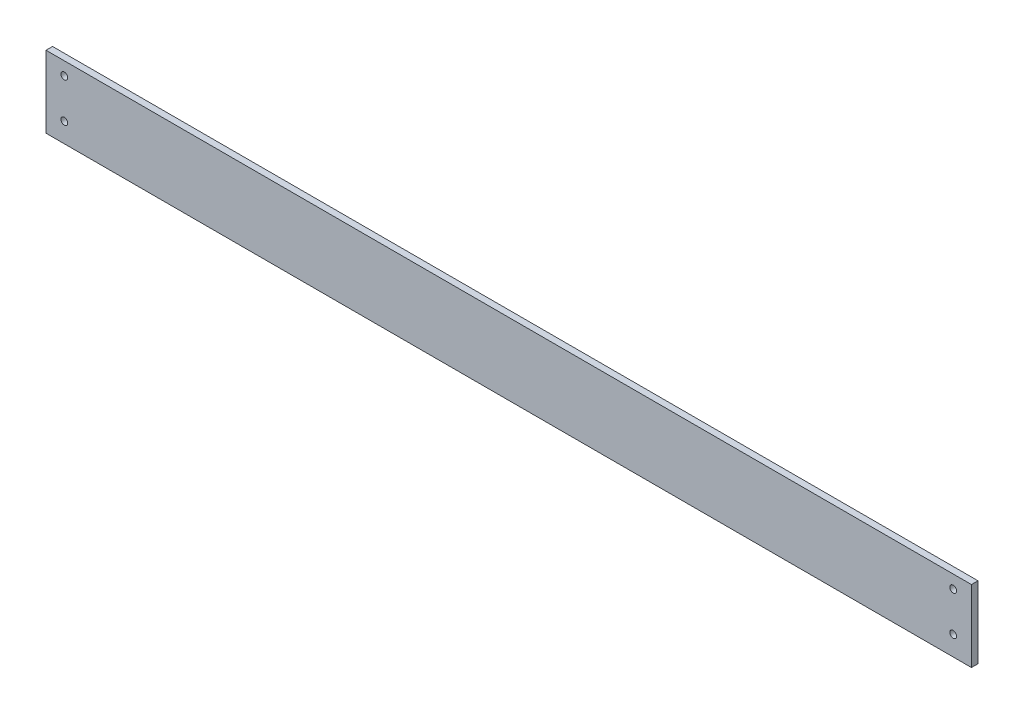
ISO-10303-21;
HEADER;
FILE_DESCRIPTION(('STEP AP214'),'2;1');
FILE_NAME('part.step','',(''),(''),'','','');
FILE_SCHEMA(('AUTOMOTIVE_DESIGN { 1 0 10303 214 1 1 1 1 }'));
ENDSEC;
DATA;
#1=APPLICATION_CONTEXT('core data for automotive mechanical design processes');
#2=APPLICATION_PROTOCOL_DEFINITION('international standard','automotive_design',2000,#1);
#3=PRODUCT_CONTEXT('',#1,'mechanical');
#4=PRODUCT('Part','Part','',(#3));
#5=PRODUCT_RELATED_PRODUCT_CATEGORY('part','',(#4));
#6=PRODUCT_DEFINITION_FORMATION('','',#4);
#7=PRODUCT_DEFINITION_CONTEXT('part definition',#1,'design');
#8=PRODUCT_DEFINITION('design','',#6,#7);
#9=PRODUCT_DEFINITION_SHAPE('','',#8);
#10=(LENGTH_UNIT() NAMED_UNIT(*) SI_UNIT(.MILLI.,.METRE.));
#11=(NAMED_UNIT(*) PLANE_ANGLE_UNIT() SI_UNIT($,.RADIAN.));
#12=(NAMED_UNIT(*) SI_UNIT($,.STERADIAN.) SOLID_ANGLE_UNIT());
#13=UNCERTAINTY_MEASURE_WITH_UNIT(LENGTH_MEASURE(1.E-05),#10,'distance_accuracy_value','');
#14=(GEOMETRIC_REPRESENTATION_CONTEXT(3) GLOBAL_UNCERTAINTY_ASSIGNED_CONTEXT((#13)) GLOBAL_UNIT_ASSIGNED_CONTEXT((#10,
#11,#12)) REPRESENTATION_CONTEXT('',''));
#15=CARTESIAN_POINT('',(0.,0.,0.));
#16=DIRECTION('',(0.,0.,1.));
#17=DIRECTION('',(1.,0.,0.));
#18=AXIS2_PLACEMENT_3D('',#15,#16,#17);
#19=CARTESIAN_POINT('',(0.,55.,0.));
#20=DIRECTION('',(0.,-1.,0.));
#21=DIRECTION('',(0.,0.,-1.));
#22=AXIS2_PLACEMENT_3D('',#19,#20,#21);
#23=PLANE('',#22);
#24=DIRECTION('',(-1.,0.,0.));
#25=VECTOR('',#24,1.);
#26=CARTESIAN_POINT('',(708.,55.,-4.99999999999998));
#27=LINE('',#26,#25);
#28=CARTESIAN_POINT('',(708.,55.,-4.99999999999998));
#29=VERTEX_POINT('',#28);
#30=CARTESIAN_POINT('',(0.,55.,-4.99999999999998));
#31=VERTEX_POINT('',#30);
#32=EDGE_CURVE('E11',#29,#31,#27,.T.);
#33=ORIENTED_EDGE('',*,*,#32,.T.);
#34=DIRECTION('',(0.,0.,1.));
#35=VECTOR('',#34,1.);
#36=CARTESIAN_POINT('',(0.,55.,0.));
#37=LINE('',#36,#35);
#38=CARTESIAN_POINT('',(0.,55.,0.));
#39=VERTEX_POINT('',#38);
#40=EDGE_CURVE('E46',#31,#39,#37,.T.);
#41=ORIENTED_EDGE('',*,*,#40,.T.);
#42=DIRECTION('',(-1.,0.,0.));
#43=VECTOR('',#42,1.);
#44=CARTESIAN_POINT('',(708.,55.,0.));
#45=LINE('',#44,#43);
#46=CARTESIAN_POINT('',(708.,55.,0.));
#47=VERTEX_POINT('',#46);
#48=EDGE_CURVE('E97',#47,#39,#45,.T.);
#49=ORIENTED_EDGE('',*,*,#48,.F.);
#50=DIRECTION('',(0.,0.,1.));
#51=VECTOR('',#50,1.);
#52=CARTESIAN_POINT('',(708.,55.,0.));
#53=LINE('',#52,#51);
#54=EDGE_CURVE('E41',#29,#47,#53,.T.);
#55=ORIENTED_EDGE('',*,*,#54,.F.);
#56=EDGE_LOOP('',(#33,#41,#49,#55));
#57=FACE_BOUND('',#56,.T.);
#58=ADVANCED_FACE('F38',(#57),#23,.F.);
#59=CARTESIAN_POINT('',(708.,55.,-4.99999999999998));
#60=DIRECTION('',(0.,0.,1.));
#61=DIRECTION('',(0.,-1.,0.));
#62=AXIS2_PLACEMENT_3D('',#59,#60,#61);
#63=PLANE('',#62);
#64=CARTESIAN_POINT('',(14.,15.0000000000001,-4.99999999999999));
#65=DIRECTION('',(0.,0.,1.));
#66=DIRECTION('',(0.,1.,0.));
#67=AXIS2_PLACEMENT_3D('',#64,#65,#66);
#68=CIRCLE('',#67,2.60000000000007);
#69=CARTESIAN_POINT('',(14.,17.6000000000002,-4.99999999999999));
#70=VERTEX_POINT('',#69);
#71=EDGE_CURVE('E135',#70,#70,#68,.T.);
#72=ORIENTED_EDGE('',*,*,#71,.T.);
#73=EDGE_LOOP('',(#72));
#74=FACE_BOUND('',#73,.T.);
#75=CARTESIAN_POINT('',(694.,15.,-4.99999999999999));
#76=DIRECTION('',(0.,0.,-1.));
#77=DIRECTION('',(0.,1.,0.));
#78=AXIS2_PLACEMENT_3D('',#75,#76,#77);
#79=CIRCLE('',#78,2.60000000000007);
#80=CARTESIAN_POINT('',(694.,17.6000000000001,-4.99999999999999));
#81=VERTEX_POINT('',#80);
#82=EDGE_CURVE('E129',#81,#81,#79,.T.);
#83=ORIENTED_EDGE('',*,*,#82,.F.);
#84=EDGE_LOOP('',(#83));
#85=FACE_BOUND('',#84,.T.);
#86=CARTESIAN_POINT('',(14.,45.0000000000001,-4.99999999999998));
#87=DIRECTION('',(0.,0.,1.));
#88=DIRECTION('',(0.,1.,0.));
#89=AXIS2_PLACEMENT_3D('',#86,#87,#88);
#90=CIRCLE('',#89,2.60000000000007);
#91=CARTESIAN_POINT('',(14.,47.6000000000002,-4.99999999999998));
#92=VERTEX_POINT('',#91);
#93=EDGE_CURVE('E123',#92,#92,#90,.T.);
#94=ORIENTED_EDGE('',*,*,#93,.T.);
#95=EDGE_LOOP('',(#94));
#96=FACE_BOUND('',#95,.T.);
#97=ORIENTED_EDGE('',*,*,#32,.F.);
#98=DIRECTION('',(0.,1.,0.));
#99=VECTOR('',#98,1.);
#100=CARTESIAN_POINT('',(708.,55.,-4.99999999999998));
#101=LINE('',#100,#99);
#102=CARTESIAN_POINT('',(708.,0.,-4.99999999999999));
#103=VERTEX_POINT('',#102);
#104=EDGE_CURVE('E62',#103,#29,#101,.T.);
#105=ORIENTED_EDGE('',*,*,#104,.F.);
#106=DIRECTION('',(-1.,0.,0.));
#107=VECTOR('',#106,1.);
#108=CARTESIAN_POINT('',(708.,0.,-4.99999999999999));
#109=LINE('',#108,#107);
#110=CARTESIAN_POINT('',(0.,0.,-4.99999999999999));
#111=VERTEX_POINT('',#110);
#112=EDGE_CURVE('E81',#103,#111,#109,.T.);
#113=ORIENTED_EDGE('',*,*,#112,.T.);
#114=DIRECTION('',(0.,1.,0.));
#115=VECTOR('',#114,1.);
#116=CARTESIAN_POINT('',(0.,55.,-4.99999999999998));
#117=LINE('',#116,#115);
#118=EDGE_CURVE('E54',#111,#31,#117,.T.);
#119=ORIENTED_EDGE('',*,*,#118,.T.);
#120=EDGE_LOOP('',(#97,#105,#113,#119));
#121=FACE_BOUND('',#120,.T.);
#122=CARTESIAN_POINT('',(694.,45.,-4.99999999999998));
#123=DIRECTION('',(0.,0.,-1.));
#124=DIRECTION('',(0.,1.,0.));
#125=AXIS2_PLACEMENT_3D('',#122,#123,#124);
#126=CIRCLE('',#125,2.60000000000007);
#127=CARTESIAN_POINT('',(694.,47.6000000000001,-4.99999999999998));
#128=VERTEX_POINT('',#127);
#129=EDGE_CURVE('E115',#128,#128,#126,.T.);
#130=ORIENTED_EDGE('',*,*,#129,.F.);
#131=EDGE_LOOP('',(#130));
#132=FACE_BOUND('',#131,.T.);
#133=ADVANCED_FACE('F78',(#74,#85,#96,#121,#132),#63,.F.);
#134=CARTESIAN_POINT('',(708.,0.,-4.99999999999999));
#135=DIRECTION('',(0.,1.,0.));
#136=DIRECTION('',(0.,0.,1.));
#137=AXIS2_PLACEMENT_3D('',#134,#135,#136);
#138=PLANE('',#137);
#139=DIRECTION('',(0.,0.,-1.));
#140=VECTOR('',#139,1.);
#141=CARTESIAN_POINT('',(0.,0.,-4.99999999999999));
#142=LINE('',#141,#140);
#143=CARTESIAN_POINT('',(0.,0.,0.));
#144=VERTEX_POINT('',#143);
#145=EDGE_CURVE('E96',#144,#111,#142,.T.);
#146=ORIENTED_EDGE('',*,*,#145,.T.);
#147=ORIENTED_EDGE('',*,*,#112,.F.);
#148=DIRECTION('',(0.,0.,-1.));
#149=VECTOR('',#148,1.);
#150=CARTESIAN_POINT('',(708.,0.,-4.99999999999999));
#151=LINE('',#150,#149);
#152=CARTESIAN_POINT('',(708.,0.,0.));
#153=VERTEX_POINT('',#152);
#154=EDGE_CURVE('E84',#153,#103,#151,.T.);
#155=ORIENTED_EDGE('',*,*,#154,.F.);
#156=DIRECTION('',(-1.,0.,0.));
#157=VECTOR('',#156,1.);
#158=CARTESIAN_POINT('',(708.,0.,0.));
#159=LINE('',#158,#157);
#160=EDGE_CURVE('E99',#153,#144,#159,.T.);
#161=ORIENTED_EDGE('',*,*,#160,.T.);
#162=EDGE_LOOP('',(#146,#147,#155,#161));
#163=FACE_BOUND('',#162,.T.);
#164=ADVANCED_FACE('F94',(#163),#138,.F.);
#165=CARTESIAN_POINT('',(708.,0.,0.));
#166=DIRECTION('',(0.,0.,-1.));
#167=DIRECTION('',(-1.,0.,0.));
#168=AXIS2_PLACEMENT_3D('',#165,#166,#167);
#169=PLANE('',#168);
#170=CARTESIAN_POINT('',(14.,15.0000000000001,0.));
#171=DIRECTION('',(0.,0.,1.));
#172=DIRECTION('',(0.,1.,0.));
#173=AXIS2_PLACEMENT_3D('',#170,#171,#172);
#174=CIRCLE('',#173,2.60000000000007);
#175=CARTESIAN_POINT('',(14.,17.6000000000002,0.));
#176=VERTEX_POINT('',#175);
#177=EDGE_CURVE('E132',#176,#176,#174,.T.);
#178=ORIENTED_EDGE('',*,*,#177,.F.);
#179=EDGE_LOOP('',(#178));
#180=FACE_BOUND('',#179,.T.);
#181=CARTESIAN_POINT('',(694.,15.,0.));
#182=DIRECTION('',(0.,0.,-1.));
#183=DIRECTION('',(0.,1.,0.));
#184=AXIS2_PLACEMENT_3D('',#181,#182,#183);
#185=CIRCLE('',#184,2.60000000000007);
#186=CARTESIAN_POINT('',(694.,17.6000000000001,0.));
#187=VERTEX_POINT('',#186);
#188=EDGE_CURVE('E126',#187,#187,#185,.T.);
#189=ORIENTED_EDGE('',*,*,#188,.T.);
#190=EDGE_LOOP('',(#189));
#191=FACE_BOUND('',#190,.T.);
#192=CARTESIAN_POINT('',(14.,45.0000000000001,0.));
#193=DIRECTION('',(0.,0.,1.));
#194=DIRECTION('',(0.,1.,0.));
#195=AXIS2_PLACEMENT_3D('',#192,#193,#194);
#196=CIRCLE('',#195,2.60000000000007);
#197=CARTESIAN_POINT('',(14.,47.6000000000002,0.));
#198=VERTEX_POINT('',#197);
#199=EDGE_CURVE('E120',#198,#198,#196,.T.);
#200=ORIENTED_EDGE('',*,*,#199,.F.);
#201=EDGE_LOOP('',(#200));
#202=FACE_BOUND('',#201,.T.);
#203=CARTESIAN_POINT('',(694.,45.,0.));
#204=DIRECTION('',(0.,0.,-1.));
#205=DIRECTION('',(0.,1.,0.));
#206=AXIS2_PLACEMENT_3D('',#203,#204,#205);
#207=CIRCLE('',#206,2.60000000000007);
#208=CARTESIAN_POINT('',(694.,47.6000000000001,0.));
#209=VERTEX_POINT('',#208);
#210=EDGE_CURVE('E113',#209,#209,#207,.T.);
#211=ORIENTED_EDGE('',*,*,#210,.T.);
#212=EDGE_LOOP('',(#211));
#213=FACE_BOUND('',#212,.T.);
#214=DIRECTION('',(0.,-1.,0.));
#215=VECTOR('',#214,1.);
#216=CARTESIAN_POINT('',(0.,0.,0.));
#217=LINE('',#216,#215);
#218=EDGE_CURVE('E92',#39,#144,#217,.T.);
#219=ORIENTED_EDGE('',*,*,#218,.T.);
#220=ORIENTED_EDGE('',*,*,#160,.F.);
#221=DIRECTION('',(0.,-1.,0.));
#222=VECTOR('',#221,1.);
#223=CARTESIAN_POINT('',(708.,0.,0.));
#224=LINE('',#223,#222);
#225=EDGE_CURVE('E83',#47,#153,#224,.T.);
#226=ORIENTED_EDGE('',*,*,#225,.F.);
#227=ORIENTED_EDGE('',*,*,#48,.T.);
#228=EDGE_LOOP('',(#219,#220,#226,#227));
#229=FACE_BOUND('',#228,.T.);
#230=ADVANCED_FACE('F144',(#180,#191,#202,#213,#229),#169,.F.);
#231=CARTESIAN_POINT('',(708.,0.,0.));
#232=DIRECTION('',(-1.,0.,0.));
#233=DIRECTION('',(0.,0.,1.));
#234=AXIS2_PLACEMENT_3D('',#231,#232,#233);
#235=PLANE('',#234);
#236=ORIENTED_EDGE('',*,*,#104,.T.);
#237=ORIENTED_EDGE('',*,*,#54,.T.);
#238=ORIENTED_EDGE('',*,*,#225,.T.);
#239=ORIENTED_EDGE('',*,*,#154,.T.);
#240=EDGE_LOOP('',(#236,#237,#238,#239));
#241=FACE_BOUND('',#240,.T.);
#242=ADVANCED_FACE('F87',(#241),#235,.F.);
#243=CARTESIAN_POINT('',(0.,0.,0.));
#244=DIRECTION('',(-1.,0.,0.));
#245=DIRECTION('',(0.,0.,1.));
#246=AXIS2_PLACEMENT_3D('',#243,#244,#245);
#247=PLANE('',#246);
#248=ORIENTED_EDGE('',*,*,#40,.F.);
#249=ORIENTED_EDGE('',*,*,#118,.F.);
#250=ORIENTED_EDGE('',*,*,#145,.F.);
#251=ORIENTED_EDGE('',*,*,#218,.F.);
#252=EDGE_LOOP('',(#248,#249,#250,#251));
#253=FACE_BOUND('',#252,.T.);
#254=ADVANCED_FACE('F106',(#253),#247,.T.);
#255=CARTESIAN_POINT('',(694.,45.,0.));
#256=DIRECTION('',(0.,0.,-1.));
#257=DIRECTION('',(0.,1.,0.));
#258=AXIS2_PLACEMENT_3D('',#255,#256,#257);
#259=CYLINDRICAL_SURFACE('',#258,2.60000000000007);
#260=ORIENTED_EDGE('',*,*,#210,.F.);
#261=EDGE_LOOP('',(#260));
#262=FACE_BOUND('',#261,.T.);
#263=ORIENTED_EDGE('',*,*,#129,.T.);
#264=EDGE_LOOP('',(#263));
#265=FACE_BOUND('',#264,.T.);
#266=ADVANCED_FACE('F156',(#262,#265),#259,.F.);
#267=CARTESIAN_POINT('',(14.,45.0000000000001,0.));
#268=DIRECTION('',(0.,0.,-1.));
#269=DIRECTION('',(0.,1.,0.));
#270=AXIS2_PLACEMENT_3D('',#267,#268,#269);
#271=CYLINDRICAL_SURFACE('',#270,2.60000000000007);
#272=ORIENTED_EDGE('',*,*,#199,.T.);
#273=EDGE_LOOP('',(#272));
#274=FACE_BOUND('',#273,.T.);
#275=ORIENTED_EDGE('',*,*,#93,.F.);
#276=EDGE_LOOP('',(#275));
#277=FACE_BOUND('',#276,.T.);
#278=ADVANCED_FACE('F152',(#274,#277),#271,.F.);
#279=CARTESIAN_POINT('',(694.,15.,0.));
#280=DIRECTION('',(0.,0.,-1.));
#281=DIRECTION('',(0.,1.,0.));
#282=AXIS2_PLACEMENT_3D('',#279,#280,#281);
#283=CYLINDRICAL_SURFACE('',#282,2.60000000000007);
#284=ORIENTED_EDGE('',*,*,#188,.F.);
#285=EDGE_LOOP('',(#284));
#286=FACE_BOUND('',#285,.T.);
#287=ORIENTED_EDGE('',*,*,#82,.T.);
#288=EDGE_LOOP('',(#287));
#289=FACE_BOUND('',#288,.T.);
#290=ADVANCED_FACE('F155',(#286,#289),#283,.F.);
#291=CARTESIAN_POINT('',(14.,15.0000000000001,0.));
#292=DIRECTION('',(0.,0.,-1.));
#293=DIRECTION('',(0.,1.,0.));
#294=AXIS2_PLACEMENT_3D('',#291,#292,#293);
#295=CYLINDRICAL_SURFACE('',#294,2.60000000000007);
#296=ORIENTED_EDGE('',*,*,#177,.T.);
#297=EDGE_LOOP('',(#296));
#298=FACE_BOUND('',#297,.T.);
#299=ORIENTED_EDGE('',*,*,#71,.F.);
#300=EDGE_LOOP('',(#299));
#301=FACE_BOUND('',#300,.T.);
#302=ADVANCED_FACE('F141',(#298,#301),#295,.F.);
#303=CLOSED_SHELL('',(#58,#133,#164,#230,#242,#254,#266,#278,#290,#302));
#304=MANIFOLD_SOLID_BREP('B2',#303);
#305=ADVANCED_BREP_SHAPE_REPRESENTATION('',(#18,#304),#14);
#306=SHAPE_DEFINITION_REPRESENTATION(#9,#305);
ENDSEC;
END-ISO-10303-21;
